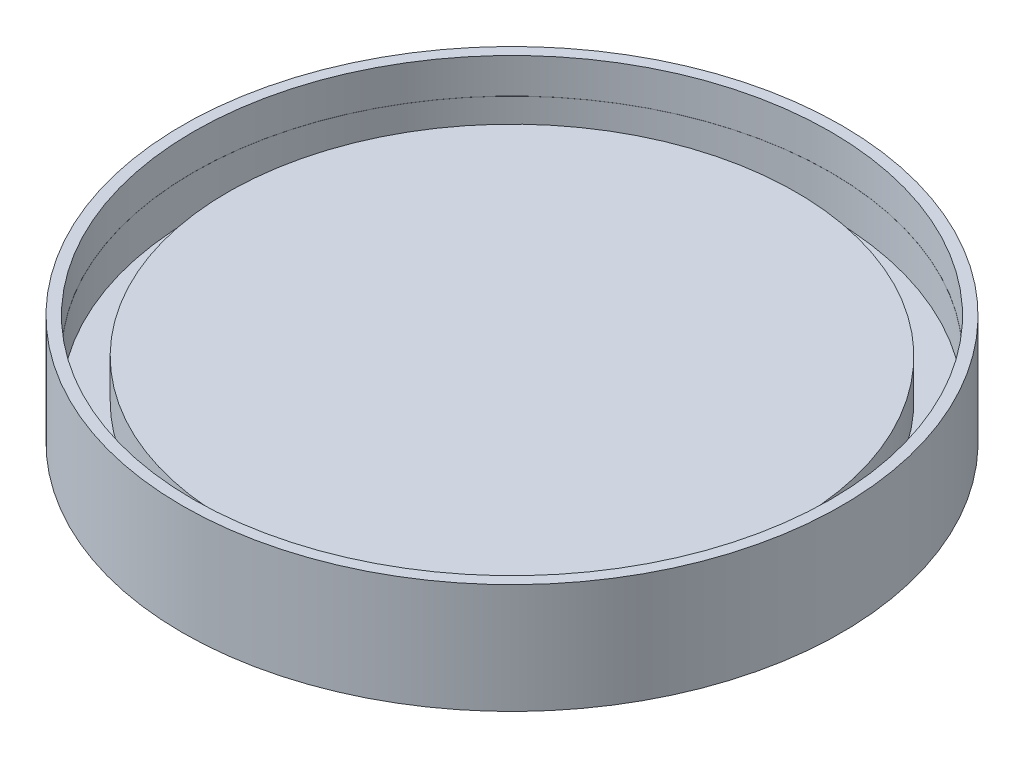
ISO-10303-21;
HEADER;
FILE_DESCRIPTION(('STEP AP214'),'2;1');
FILE_NAME('part.step','',(''),(''),'','','');
FILE_SCHEMA(('AUTOMOTIVE_DESIGN { 1 0 10303 214 1 1 1 1 }'));
ENDSEC;
DATA;
#1=APPLICATION_CONTEXT('core data for automotive mechanical design processes');
#2=APPLICATION_PROTOCOL_DEFINITION('international standard','automotive_design',2000,#1);
#3=PRODUCT_CONTEXT('',#1,'mechanical');
#4=PRODUCT('Part','Part','',(#3));
#5=PRODUCT_RELATED_PRODUCT_CATEGORY('part','',(#4));
#6=PRODUCT_DEFINITION_FORMATION('','',#4);
#7=PRODUCT_DEFINITION_CONTEXT('part definition',#1,'design');
#8=PRODUCT_DEFINITION('design','',#6,#7);
#9=PRODUCT_DEFINITION_SHAPE('','',#8);
#10=(LENGTH_UNIT() NAMED_UNIT(*) SI_UNIT(.MILLI.,.METRE.));
#11=(NAMED_UNIT(*) PLANE_ANGLE_UNIT() SI_UNIT($,.RADIAN.));
#12=(NAMED_UNIT(*) SI_UNIT($,.STERADIAN.) SOLID_ANGLE_UNIT());
#13=UNCERTAINTY_MEASURE_WITH_UNIT(LENGTH_MEASURE(1.E-05),#10,'distance_accuracy_value','');
#14=(GEOMETRIC_REPRESENTATION_CONTEXT(3) GLOBAL_UNCERTAINTY_ASSIGNED_CONTEXT((#13)) GLOBAL_UNIT_ASSIGNED_CONTEXT((#10,
#11,#12)) REPRESENTATION_CONTEXT('',''));
#15=CARTESIAN_POINT('',(0.,0.,0.));
#16=DIRECTION('',(0.,0.,1.));
#17=DIRECTION('',(1.,0.,0.));
#18=AXIS2_PLACEMENT_3D('',#15,#16,#17);
#19=CARTESIAN_POINT('',(0.,15.,0.));
#20=DIRECTION('',(0.,-1.,0.));
#21=DIRECTION('',(0.,0.,-1.));
#22=AXIS2_PLACEMENT_3D('',#19,#20,#21);
#23=CYLINDRICAL_SURFACE('',#22,45.);
#24=CARTESIAN_POINT('',(0.,15.,0.));
#25=DIRECTION('',(0.,1.,0.));
#26=DIRECTION('',(0.,0.,1.));
#27=AXIS2_PLACEMENT_3D('',#24,#25,#26);
#28=CIRCLE('',#27,45.);
#29=CARTESIAN_POINT('',(0.,15.,45.));
#30=VERTEX_POINT('',#29);
#31=EDGE_CURVE('E10',#30,#30,#28,.T.);
#32=ORIENTED_EDGE('',*,*,#31,.F.);
#33=EDGE_LOOP('',(#32));
#34=FACE_BOUND('',#33,.T.);
#35=CARTESIAN_POINT('',(0.,0.,0.));
#36=DIRECTION('',(0.,1.,0.));
#37=DIRECTION('',(0.,0.,1.));
#38=AXIS2_PLACEMENT_3D('',#35,#36,#37);
#39=CIRCLE('',#38,45.);
#40=CARTESIAN_POINT('',(0.,0.,45.));
#41=VERTEX_POINT('',#40);
#42=EDGE_CURVE('E40',#41,#41,#39,.T.);
#43=ORIENTED_EDGE('',*,*,#42,.T.);
#44=EDGE_LOOP('',(#43));
#45=FACE_BOUND('',#44,.T.);
#46=ADVANCED_FACE('F37',(#34,#45),#23,.T.);
#47=CARTESIAN_POINT('',(0.,15.,0.));
#48=DIRECTION('',(0.,1.,0.));
#49=DIRECTION('',(0.,0.,1.));
#50=AXIS2_PLACEMENT_3D('',#47,#48,#49);
#51=PLANE('',#50);
#52=CARTESIAN_POINT('',(0.,15.,0.));
#53=DIRECTION('',(0.,1.,0.));
#54=DIRECTION('',(0.,0.,1.));
#55=AXIS2_PLACEMENT_3D('',#52,#53,#54);
#56=CIRCLE('',#55,43.5);
#57=CARTESIAN_POINT('',(0.,15.,43.5));
#58=VERTEX_POINT('',#57);
#59=EDGE_CURVE('E51',#58,#58,#56,.T.);
#60=ORIENTED_EDGE('',*,*,#59,.F.);
#61=EDGE_LOOP('',(#60));
#62=FACE_BOUND('',#61,.T.);
#63=ORIENTED_EDGE('',*,*,#31,.T.);
#64=EDGE_LOOP('',(#63));
#65=FACE_BOUND('',#64,.T.);
#66=ADVANCED_FACE('F104',(#62,#65),#51,.T.);
#67=CARTESIAN_POINT('',(0.,0.,0.));
#68=DIRECTION('',(0.,1.,0.));
#69=DIRECTION('',(0.,0.,1.));
#70=AXIS2_PLACEMENT_3D('',#67,#68,#69);
#71=PLANE('',#70);
#72=ORIENTED_EDGE('',*,*,#42,.F.);
#73=EDGE_LOOP('',(#72));
#74=FACE_BOUND('',#73,.T.);
#75=ADVANCED_FACE('F100',(#74),#71,.F.);
#76=CARTESIAN_POINT('',(0.,10.2,0.));
#77=DIRECTION('',(0.,1.,0.));
#78=DIRECTION('',(0.,0.,1.));
#79=AXIS2_PLACEMENT_3D('',#76,#77,#78);
#80=CYLINDRICAL_SURFACE('',#79,43.5);
#81=CARTESIAN_POINT('',(0.,10.2,0.));
#82=DIRECTION('',(0.,1.,0.));
#83=DIRECTION('',(0.,0.,1.));
#84=AXIS2_PLACEMENT_3D('',#81,#82,#83);
#85=CIRCLE('',#84,43.5);
#86=CARTESIAN_POINT('',(0.,10.2,43.5));
#87=VERTEX_POINT('',#86);
#88=EDGE_CURVE('E49',#87,#87,#85,.T.);
#89=ORIENTED_EDGE('',*,*,#88,.F.);
#90=EDGE_LOOP('',(#89));
#91=FACE_BOUND('',#90,.T.);
#92=ORIENTED_EDGE('',*,*,#59,.T.);
#93=EDGE_LOOP('',(#92));
#94=FACE_BOUND('',#93,.T.);
#95=ADVANCED_FACE('F93',(#91,#94),#80,.F.);
#96=CARTESIAN_POINT('',(0.,10.2,0.));
#97=DIRECTION('',(0.,1.,0.));
#98=DIRECTION('',(0.,0.,1.));
#99=AXIS2_PLACEMENT_3D('',#96,#97,#98);
#100=PLANE('',#99);
#101=CARTESIAN_POINT('',(0.,10.2,0.));
#102=DIRECTION('',(0.,1.,0.));
#103=DIRECTION('',(0.,0.,1.));
#104=AXIS2_PLACEMENT_3D('',#101,#102,#103);
#105=CIRCLE('',#104,43.4879277376939);
#106=CARTESIAN_POINT('',(0.,10.2,43.4879277376939));
#107=VERTEX_POINT('',#106);
#108=EDGE_CURVE('E59',#107,#107,#105,.T.);
#109=ORIENTED_EDGE('',*,*,#108,.F.);
#110=EDGE_LOOP('',(#109));
#111=FACE_BOUND('',#110,.T.);
#112=ORIENTED_EDGE('',*,*,#88,.T.);
#113=EDGE_LOOP('',(#112));
#114=FACE_BOUND('',#113,.T.);
#115=ADVANCED_FACE('F87',(#111,#114),#100,.T.);
#116=CARTESIAN_POINT('',(0.,4.8,0.));
#117=DIRECTION('',(0.,1.,0.));
#118=DIRECTION('',(0.,0.,1.));
#119=AXIS2_PLACEMENT_3D('',#116,#117,#118);
#120=CYLINDRICAL_SURFACE('',#119,43.4879277376939);
#121=CARTESIAN_POINT('',(0.,4.8,0.));
#122=DIRECTION('',(0.,1.,0.));
#123=DIRECTION('',(0.,0.,1.));
#124=AXIS2_PLACEMENT_3D('',#121,#122,#123);
#125=CIRCLE('',#124,43.4879277376939);
#126=CARTESIAN_POINT('',(0.,4.8,43.4879277376939));
#127=VERTEX_POINT('',#126);
#128=EDGE_CURVE('E55',#127,#127,#125,.T.);
#129=CARTESIAN_POINT('',(0.,4.8,43.4879277376939));
#130=CARTESIAN_POINT('',(0.,4.85625,43.4879277376939));
#131=CARTESIAN_POINT('',(0.,4.9125,43.4879277376939));
#132=CARTESIAN_POINT('',(0.,5.025,43.4879277376939));
#133=CARTESIAN_POINT('',(0.,5.08125,43.4879277376939));
#134=CARTESIAN_POINT('',(0.,5.19375,43.4879277376939));
#135=CARTESIAN_POINT('',(0.,5.25,43.4879277376939));
#136=CARTESIAN_POINT('',(0.,5.3625,43.4879277376939));
#137=CARTESIAN_POINT('',(0.,5.41875,43.4879277376939));
#138=CARTESIAN_POINT('',(0.,5.53125,43.4879277376939));
#139=CARTESIAN_POINT('',(0.,5.5875,43.4879277376939));
#140=CARTESIAN_POINT('',(0.,5.7,43.4879277376939));
#141=CARTESIAN_POINT('',(0.,5.75625,43.4879277376939));
#142=CARTESIAN_POINT('',(0.,5.86875,43.4879277376939));
#143=CARTESIAN_POINT('',(0.,5.925,43.4879277376939));
#144=CARTESIAN_POINT('',(0.,6.0375,43.4879277376939));
#145=CARTESIAN_POINT('',(0.,6.09375,43.4879277376939));
#146=CARTESIAN_POINT('',(0.,6.20625,43.4879277376939));
#147=CARTESIAN_POINT('',(0.,6.2625,43.4879277376939));
#148=CARTESIAN_POINT('',(0.,6.375,43.4879277376939));
#149=CARTESIAN_POINT('',(0.,6.43125,43.4879277376939));
#150=CARTESIAN_POINT('',(0.,6.54375,43.4879277376939));
#151=CARTESIAN_POINT('',(0.,6.6,43.4879277376939));
#152=CARTESIAN_POINT('',(0.,6.7125,43.4879277376939));
#153=CARTESIAN_POINT('',(0.,6.76875,43.4879277376939));
#154=CARTESIAN_POINT('',(0.,6.88125,43.4879277376939));
#155=CARTESIAN_POINT('',(0.,6.9375,43.4879277376939));
#156=CARTESIAN_POINT('',(0.,7.05,43.4879277376939));
#157=CARTESIAN_POINT('',(0.,7.10625,43.4879277376939));
#158=CARTESIAN_POINT('',(0.,7.21875,43.4879277376939));
#159=CARTESIAN_POINT('',(0.,7.275,43.4879277376939));
#160=CARTESIAN_POINT('',(0.,7.3875,43.4879277376939));
#161=CARTESIAN_POINT('',(0.,7.44375,43.4879277376939));
#162=CARTESIAN_POINT('',(0.,7.55625,43.4879277376939));
#163=CARTESIAN_POINT('',(0.,7.6125,43.4879277376939));
#164=CARTESIAN_POINT('',(0.,7.725,43.4879277376939));
#165=CARTESIAN_POINT('',(0.,7.78125,43.4879277376939));
#166=CARTESIAN_POINT('',(0.,7.89375,43.4879277376939));
#167=CARTESIAN_POINT('',(0.,7.95,43.4879277376939));
#168=CARTESIAN_POINT('',(0.,8.0625,43.4879277376939));
#169=CARTESIAN_POINT('',(0.,8.11875,43.4879277376939));
#170=CARTESIAN_POINT('',(0.,8.23125,43.4879277376939));
#171=CARTESIAN_POINT('',(0.,8.2875,43.4879277376939));
#172=CARTESIAN_POINT('',(0.,8.4,43.4879277376939));
#173=CARTESIAN_POINT('',(0.,8.45625,43.4879277376939));
#174=CARTESIAN_POINT('',(0.,8.56875,43.4879277376939));
#175=CARTESIAN_POINT('',(0.,8.625,43.4879277376939));
#176=CARTESIAN_POINT('',(0.,8.7375,43.4879277376939));
#177=CARTESIAN_POINT('',(0.,8.79375,43.4879277376939));
#178=CARTESIAN_POINT('',(0.,8.90625,43.4879277376939));
#179=CARTESIAN_POINT('',(0.,8.9625,43.4879277376939));
#180=CARTESIAN_POINT('',(0.,9.075,43.4879277376939));
#181=CARTESIAN_POINT('',(0.,9.13125,43.4879277376939));
#182=CARTESIAN_POINT('',(0.,9.24375,43.4879277376939));
#183=CARTESIAN_POINT('',(0.,9.3,43.4879277376939));
#184=CARTESIAN_POINT('',(0.,9.4125,43.4879277376939));
#185=CARTESIAN_POINT('',(0.,9.46875,43.4879277376939));
#186=CARTESIAN_POINT('',(0.,9.58125,43.4879277376939));
#187=CARTESIAN_POINT('',(0.,9.6375,43.4879277376939));
#188=CARTESIAN_POINT('',(0.,9.75,43.4879277376939));
#189=CARTESIAN_POINT('',(0.,9.80625,43.4879277376939));
#190=CARTESIAN_POINT('',(0.,9.91875,43.4879277376939));
#191=CARTESIAN_POINT('',(0.,9.975,43.4879277376939));
#192=CARTESIAN_POINT('',(0.,10.0875,43.4879277376939));
#193=CARTESIAN_POINT('',(0.,10.14375,43.4879277376939));
#194=CARTESIAN_POINT('',(0.,10.2,43.4879277376939));
#195=B_SPLINE_CURVE_WITH_KNOTS('',3,(#129,#130,#131,#132,#133,#134,#135,#136,#137,#138,#139,
#140,#141,#142,#143,#144,#145,#146,#147,#148,#149,#150,#151,#152,#153,#154,#155,#156,#157,#158,
#159,#160,#161,#162,#163,#164,#165,#166,#167,#168,#169,#170,#171,#172,#173,#174,#175,#176,#177,
#178,#179,#180,#181,#182,#183,#184,#185,#186,#187,#188,#189,#190,#191,#192,#193,#194),
.UNSPECIFIED.,.F.,.F.,(4,2,2,2,2,2,2,2,2,2,2,2,2,2,2,2,2,2,2,2,2,2,2,2,2,2,2,2,2,2,2,2,4),(0.,
0.168750000000001,0.3375,0.506250000000001,0.675,0.843750000000001,1.0125,1.18125,1.35,1.51875,
1.6875,1.85625,2.025,2.19375,2.3625,2.53125,2.7,2.86875,3.0375,3.20625,3.375,3.54375,3.7125,
3.88125,4.05,4.21875,4.3875,4.55625,4.725,4.89375,5.0625,5.23125,5.4),.UNSPECIFIED.);
#196=EDGE_CURVE('BSEAM81',#127,#107,#195,.T.);
#197=ORIENTED_EDGE('',*,*,#128,.F.);
#198=ORIENTED_EDGE('',*,*,#108,.T.);
#199=ORIENTED_EDGE('',*,*,#196,.T.);
#200=ORIENTED_EDGE('',*,*,#196,.F.);
#201=EDGE_LOOP('',(#197,#199,#198,#200));
#202=FACE_BOUND('',#201,.T.);
#203=ADVANCED_FACE('F81',(#202),#120,.F.);
#204=CARTESIAN_POINT('',(0.,4.8,0.));
#205=DIRECTION('',(0.,1.,0.));
#206=DIRECTION('',(0.,0.,1.));
#207=AXIS2_PLACEMENT_3D('',#204,#205,#206);
#208=PLANE('',#207);
#209=CARTESIAN_POINT('',(0.,4.8,0.));
#210=DIRECTION('',(0.,1.,0.));
#211=DIRECTION('',(0.,0.,1.));
#212=AXIS2_PLACEMENT_3D('',#209,#210,#211);
#213=CIRCLE('',#212,38.8);
#214=CARTESIAN_POINT('',(0.,4.8,38.8));
#215=VERTEX_POINT('',#214);
#216=EDGE_CURVE('E63',#215,#215,#213,.T.);
#217=ORIENTED_EDGE('',*,*,#216,.F.);
#218=EDGE_LOOP('',(#217));
#219=FACE_BOUND('',#218,.T.);
#220=ORIENTED_EDGE('',*,*,#128,.T.);
#221=EDGE_LOOP('',(#220));
#222=FACE_BOUND('',#221,.T.);
#223=ADVANCED_FACE('F78',(#219,#222),#208,.T.);
#224=CARTESIAN_POINT('',(0.,4.8,0.));
#225=DIRECTION('',(0.,1.,0.));
#226=DIRECTION('',(0.,0.,1.));
#227=AXIS2_PLACEMENT_3D('',#224,#225,#226);
#228=CYLINDRICAL_SURFACE('',#227,38.8);
#229=CARTESIAN_POINT('',(0.,10.2,0.));
#230=DIRECTION('',(0.,1.,0.));
#231=DIRECTION('',(0.,0.,1.));
#232=AXIS2_PLACEMENT_3D('',#229,#230,#231);
#233=CIRCLE('',#232,38.8);
#234=CARTESIAN_POINT('',(0.,10.2,38.8));
#235=VERTEX_POINT('',#234);
#236=EDGE_CURVE('E67',#235,#235,#233,.T.);
#237=CARTESIAN_POINT('',(0.,4.8,38.8));
#238=CARTESIAN_POINT('',(0.,4.85625,38.8));
#239=CARTESIAN_POINT('',(0.,4.9125,38.8));
#240=CARTESIAN_POINT('',(0.,5.025,38.8));
#241=CARTESIAN_POINT('',(0.,5.08125,38.8));
#242=CARTESIAN_POINT('',(0.,5.19375,38.8));
#243=CARTESIAN_POINT('',(0.,5.25,38.8));
#244=CARTESIAN_POINT('',(0.,5.3625,38.8));
#245=CARTESIAN_POINT('',(0.,5.41875,38.8));
#246=CARTESIAN_POINT('',(0.,5.53125,38.8));
#247=CARTESIAN_POINT('',(0.,5.5875,38.8));
#248=CARTESIAN_POINT('',(0.,5.7,38.8));
#249=CARTESIAN_POINT('',(0.,5.75625,38.8));
#250=CARTESIAN_POINT('',(0.,5.86875,38.8));
#251=CARTESIAN_POINT('',(0.,5.925,38.8));
#252=CARTESIAN_POINT('',(0.,6.0375,38.8));
#253=CARTESIAN_POINT('',(0.,6.09375,38.8));
#254=CARTESIAN_POINT('',(0.,6.20625,38.8));
#255=CARTESIAN_POINT('',(0.,6.2625,38.8));
#256=CARTESIAN_POINT('',(0.,6.375,38.8));
#257=CARTESIAN_POINT('',(0.,6.43125,38.8));
#258=CARTESIAN_POINT('',(0.,6.54375,38.8));
#259=CARTESIAN_POINT('',(0.,6.6,38.8));
#260=CARTESIAN_POINT('',(0.,6.7125,38.8));
#261=CARTESIAN_POINT('',(0.,6.76875,38.8));
#262=CARTESIAN_POINT('',(0.,6.88125,38.8));
#263=CARTESIAN_POINT('',(0.,6.9375,38.8));
#264=CARTESIAN_POINT('',(0.,7.05,38.8));
#265=CARTESIAN_POINT('',(0.,7.10625,38.8));
#266=CARTESIAN_POINT('',(0.,7.21875,38.8));
#267=CARTESIAN_POINT('',(0.,7.275,38.8));
#268=CARTESIAN_POINT('',(0.,7.3875,38.8));
#269=CARTESIAN_POINT('',(0.,7.44375,38.8));
#270=CARTESIAN_POINT('',(0.,7.55625,38.8));
#271=CARTESIAN_POINT('',(0.,7.6125,38.8));
#272=CARTESIAN_POINT('',(0.,7.725,38.8));
#273=CARTESIAN_POINT('',(0.,7.78125,38.8));
#274=CARTESIAN_POINT('',(0.,7.89375,38.8));
#275=CARTESIAN_POINT('',(0.,7.95,38.8));
#276=CARTESIAN_POINT('',(0.,8.0625,38.8));
#277=CARTESIAN_POINT('',(0.,8.11875,38.8));
#278=CARTESIAN_POINT('',(0.,8.23125,38.8));
#279=CARTESIAN_POINT('',(0.,8.2875,38.8));
#280=CARTESIAN_POINT('',(0.,8.4,38.8));
#281=CARTESIAN_POINT('',(0.,8.45625,38.8));
#282=CARTESIAN_POINT('',(0.,8.56875,38.8));
#283=CARTESIAN_POINT('',(0.,8.625,38.8));
#284=CARTESIAN_POINT('',(0.,8.7375,38.8));
#285=CARTESIAN_POINT('',(0.,8.79375,38.8));
#286=CARTESIAN_POINT('',(0.,8.90625,38.8));
#287=CARTESIAN_POINT('',(0.,8.9625,38.8));
#288=CARTESIAN_POINT('',(0.,9.075,38.8));
#289=CARTESIAN_POINT('',(0.,9.13125,38.8));
#290=CARTESIAN_POINT('',(0.,9.24375,38.8));
#291=CARTESIAN_POINT('',(0.,9.3,38.8));
#292=CARTESIAN_POINT('',(0.,9.4125,38.8));
#293=CARTESIAN_POINT('',(0.,9.46875,38.8));
#294=CARTESIAN_POINT('',(0.,9.58125,38.8));
#295=CARTESIAN_POINT('',(0.,9.6375,38.8));
#296=CARTESIAN_POINT('',(0.,9.75,38.8));
#297=CARTESIAN_POINT('',(0.,9.80625,38.8));
#298=CARTESIAN_POINT('',(0.,9.91875,38.8));
#299=CARTESIAN_POINT('',(0.,9.975,38.8));
#300=CARTESIAN_POINT('',(0.,10.0875,38.8));
#301=CARTESIAN_POINT('',(0.,10.14375,38.8));
#302=CARTESIAN_POINT('',(0.,10.2,38.8));
#303=B_SPLINE_CURVE_WITH_KNOTS('',3,(#237,#238,#239,#240,#241,#242,#243,#244,#245,#246,#247,
#248,#249,#250,#251,#252,#253,#254,#255,#256,#257,#258,#259,#260,#261,#262,#263,#264,#265,#266,
#267,#268,#269,#270,#271,#272,#273,#274,#275,#276,#277,#278,#279,#280,#281,#282,#283,#284,#285,
#286,#287,#288,#289,#290,#291,#292,#293,#294,#295,#296,#297,#298,#299,#300,#301,#302),
.UNSPECIFIED.,.F.,.F.,(4,2,2,2,2,2,2,2,2,2,2,2,2,2,2,2,2,2,2,2,2,2,2,2,2,2,2,2,2,2,2,2,4),(0.,
0.16875,0.337499999999999,0.50625,0.674999999999999,0.84375,1.0125,1.18125,1.35,1.51875,1.6875,
1.85625,2.025,2.19375,2.3625,2.53125,2.7,2.86875,3.0375,3.20625,3.375,3.54375,3.7125,3.88125,
4.05,4.21875,4.3875,4.55625,4.725,4.89375,5.0625,5.23125,5.4),.UNSPECIFIED.);
#304=EDGE_CURVE('BSEAM75',#215,#235,#303,.T.);
#305=ORIENTED_EDGE('',*,*,#216,.T.);
#306=ORIENTED_EDGE('',*,*,#236,.F.);
#307=ORIENTED_EDGE('',*,*,#304,.T.);
#308=ORIENTED_EDGE('',*,*,#304,.F.);
#309=EDGE_LOOP('',(#305,#307,#306,#308));
#310=FACE_BOUND('',#309,.T.);
#311=ADVANCED_FACE('F75',(#310),#228,.T.);
#312=ORIENTED_EDGE('',*,*,#236,.T.);
#313=EDGE_LOOP('',(#312));
#314=FACE_BOUND('',#313,.T.);
#315=ADVANCED_FACE('F95',(#314),#100,.T.);
#316=CLOSED_SHELL('',(#46,#66,#75,#95,#115,#203,#223,#311,#315));
#317=MANIFOLD_SOLID_BREP('B2',#316);
#318=ADVANCED_BREP_SHAPE_REPRESENTATION('',(#18,#317),#14);
#319=SHAPE_DEFINITION_REPRESENTATION(#9,#318);
ENDSEC;
END-ISO-10303-21;
